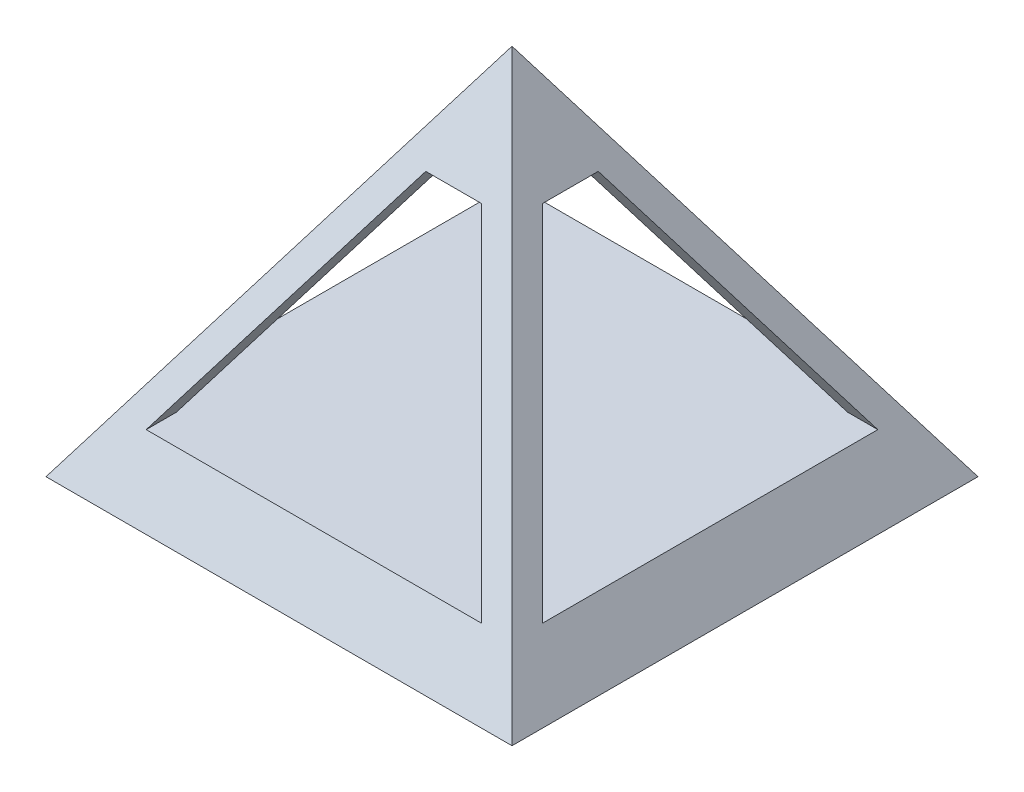
ISO-10303-21;
HEADER;
FILE_DESCRIPTION(('STEP AP214'),'2;1');
FILE_NAME('part.step','',(''),(''),'','','');
FILE_SCHEMA(('AUTOMOTIVE_DESIGN { 1 0 10303 214 1 1 1 1 }'));
ENDSEC;
DATA;
#1=APPLICATION_CONTEXT('core data for automotive mechanical design processes');
#2=APPLICATION_PROTOCOL_DEFINITION('international standard','automotive_design',2000,#1);
#3=PRODUCT_CONTEXT('',#1,'mechanical');
#4=PRODUCT('Part','Part','',(#3));
#5=PRODUCT_RELATED_PRODUCT_CATEGORY('part','',(#4));
#6=PRODUCT_DEFINITION_FORMATION('','',#4);
#7=PRODUCT_DEFINITION_CONTEXT('part definition',#1,'design');
#8=PRODUCT_DEFINITION('design','',#6,#7);
#9=PRODUCT_DEFINITION_SHAPE('','',#8);
#10=(LENGTH_UNIT() NAMED_UNIT(*) SI_UNIT(.MILLI.,.METRE.));
#11=(NAMED_UNIT(*) PLANE_ANGLE_UNIT() SI_UNIT($,.RADIAN.));
#12=(NAMED_UNIT(*) SI_UNIT($,.STERADIAN.) SOLID_ANGLE_UNIT());
#13=UNCERTAINTY_MEASURE_WITH_UNIT(LENGTH_MEASURE(1.E-05),#10,'distance_accuracy_value','');
#14=(GEOMETRIC_REPRESENTATION_CONTEXT(3) GLOBAL_UNCERTAINTY_ASSIGNED_CONTEXT((#13)) GLOBAL_UNIT_ASSIGNED_CONTEXT((#10,
#11,#12)) REPRESENTATION_CONTEXT('',''));
#15=CARTESIAN_POINT('',(0.,0.,0.));
#16=DIRECTION('',(0.,0.,1.));
#17=DIRECTION('',(1.,0.,0.));
#18=AXIS2_PLACEMENT_3D('',#15,#16,#17);
#19=CARTESIAN_POINT('',(18.,6.,40.));
#20=DIRECTION('',(-0.847998304005088,-0.52999894000318,0.));
#21=DIRECTION('',(0.52999894000318,-0.847998304005088,0.));
#22=AXIS2_PLACEMENT_3D('',#19,#20,#21);
#23=PLANE('',#22);
#24=DIRECTION('',(-0.468292905790847,0.749268649265355,-0.468292905790847));
#25=VECTOR('',#24,1.);
#26=CARTESIAN_POINT('',(22.8245614035088,-1.71929824561403,22.8245614035088));
#27=LINE('',#26,#25);
#28=CARTESIAN_POINT('',(18.,6.,18.));
#29=VERTEX_POINT('',#28);
#30=CARTESIAN_POINT('',(3.,30.,3.));
#31=VERTEX_POINT('',#30);
#32=EDGE_CURVE('E394',#29,#31,#27,.T.);
#33=ORIENTED_EDGE('',*,*,#32,.F.);
#34=DIRECTION('',(0.,0.,-1.));
#35=VECTOR('',#34,1.);
#36=CARTESIAN_POINT('',(18.,6.,40.));
#37=LINE('',#36,#35);
#38=CARTESIAN_POINT('',(18.,6.,21.25));
#39=VERTEX_POINT('',#38);
#40=EDGE_CURVE('E409',#39,#29,#37,.T.);
#41=ORIENTED_EDGE('',*,*,#40,.F.);
#42=DIRECTION('',(0.468292905790847,-0.749268649265355,0.468292905790847));
#43=VECTOR('',#42,1.);
#44=CARTESIAN_POINT('',(11.4978070175439,16.4035087719298,14.7478070175439));
#45=LINE('',#44,#43);
#46=CARTESIAN_POINT('',(3.,30.,6.25000000000001));
#47=VERTEX_POINT('',#46);
#48=EDGE_CURVE('E236',#47,#39,#45,.T.);
#49=ORIENTED_EDGE('',*,*,#48,.F.);
#50=DIRECTION('',(0.,0.,-1.));
#51=VECTOR('',#50,1.);
#52=CARTESIAN_POINT('',(3.,30.,40.));
#53=LINE('',#52,#51);
#54=EDGE_CURVE('E219',#47,#31,#53,.T.);
#55=ORIENTED_EDGE('',*,*,#54,.T.);
#56=EDGE_LOOP('',(#33,#41,#49,#55));
#57=FACE_BOUND('',#56,.T.);
#58=ADVANCED_FACE('F51',(#57),#23,.T.);
#59=CARTESIAN_POINT('',(-3.,30.,40.));
#60=DIRECTION('',(0.847998304005088,-0.52999894000318,0.));
#61=DIRECTION('',(0.52999894000318,0.847998304005088,0.));
#62=AXIS2_PLACEMENT_3D('',#59,#60,#61);
#63=PLANE('',#62);
#64=DIRECTION('',(-0.468292905790847,-0.749268649265355,0.468292905790847));
#65=VECTOR('',#64,1.);
#66=CARTESIAN_POINT('',(-11.1140350877193,17.0175438596491,11.1140350877193));
#67=LINE('',#66,#65);
#68=CARTESIAN_POINT('',(-3.,30.,3.));
#69=VERTEX_POINT('',#68);
#70=CARTESIAN_POINT('',(-18.,6.,18.));
#71=VERTEX_POINT('',#70);
#72=EDGE_CURVE('E448',#69,#71,#67,.T.);
#73=ORIENTED_EDGE('',*,*,#72,.F.);
#74=DIRECTION('',(0.,0.,-1.));
#75=VECTOR('',#74,1.);
#76=CARTESIAN_POINT('',(-3.,30.,40.));
#77=LINE('',#76,#75);
#78=CARTESIAN_POINT('',(-3.,30.,6.25));
#79=VERTEX_POINT('',#78);
#80=EDGE_CURVE('E220',#79,#69,#77,.T.);
#81=ORIENTED_EDGE('',*,*,#80,.F.);
#82=DIRECTION('',(0.468292905790847,0.749268649265355,-0.468292905790847));
#83=VECTOR('',#82,1.);
#84=CARTESIAN_POINT('',(-11.4978070175439,16.4035087719298,14.7478070175439));
#85=LINE('',#84,#83);
#86=CARTESIAN_POINT('',(-18.,5.99999999999999,21.25));
#87=VERTEX_POINT('',#86);
#88=EDGE_CURVE('E230',#87,#79,#85,.T.);
#89=ORIENTED_EDGE('',*,*,#88,.F.);
#90=DIRECTION('',(0.,0.,-1.));
#91=VECTOR('',#90,1.);
#92=CARTESIAN_POINT('',(-18.,5.99999999999999,40.));
#93=LINE('',#92,#91);
#94=EDGE_CURVE('E412',#87,#71,#93,.T.);
#95=ORIENTED_EDGE('',*,*,#94,.T.);
#96=EDGE_LOOP('',(#73,#81,#89,#95));
#97=FACE_BOUND('',#96,.T.);
#98=ADVANCED_FACE('F181',(#97),#63,.T.);
#99=CARTESIAN_POINT('',(0.,11.2359550561798,17.9775280898876));
#100=DIRECTION('',(0.,0.52999894000318,0.847998304005088));
#101=DIRECTION('',(0.,-0.847998304005088,0.52999894000318));
#102=AXIS2_PLACEMENT_3D('',#99,#100,#101);
#103=PLANE('',#102);
#104=DIRECTION('',(-0.468292905790847,-0.749268649265355,0.468292905790847));
#105=VECTOR('',#104,1.);
#106=CARTESIAN_POINT('',(0.,40.,0.));
#107=LINE('',#106,#105);
#108=CARTESIAN_POINT('',(0.,40.,0.));
#109=VERTEX_POINT('',#108);
#110=CARTESIAN_POINT('',(-25.,0.,25.));
#111=VERTEX_POINT('',#110);
#112=EDGE_CURVE('E305',#109,#111,#107,.T.);
#113=ORIENTED_EDGE('',*,*,#112,.T.);
#114=DIRECTION('',(1.,0.,0.));
#115=VECTOR('',#114,1.);
#116=CARTESIAN_POINT('',(-25.,0.,25.));
#117=LINE('',#116,#115);
#118=CARTESIAN_POINT('',(25.,0.,25.));
#119=VERTEX_POINT('',#118);
#120=EDGE_CURVE('E335',#111,#119,#117,.T.);
#121=ORIENTED_EDGE('',*,*,#120,.T.);
#122=DIRECTION('',(0.468292905790847,-0.749268649265355,0.468292905790847));
#123=VECTOR('',#122,1.);
#124=CARTESIAN_POINT('',(0.,40.,0.));
#125=LINE('',#124,#123);
#126=EDGE_CURVE('E261',#109,#119,#125,.T.);
#127=ORIENTED_EDGE('',*,*,#126,.F.);
#128=EDGE_LOOP('',(#113,#121,#127));
#129=FACE_BOUND('',#128,.T.);
#130=DIRECTION('',(1.,0.,0.));
#131=VECTOR('',#130,1.);
#132=CARTESIAN_POINT('',(0.,30.,6.25));
#133=LINE('',#132,#131);
#134=EDGE_CURVE('E233',#79,#47,#133,.T.);
#135=ORIENTED_EDGE('',*,*,#134,.T.);
#136=ORIENTED_EDGE('',*,*,#48,.T.);
#137=DIRECTION('',(-1.,0.,0.));
#138=VECTOR('',#137,1.);
#139=CARTESIAN_POINT('',(0.,6.,21.25));
#140=LINE('',#139,#138);
#141=EDGE_CURVE('E223',#39,#87,#140,.T.);
#142=ORIENTED_EDGE('',*,*,#141,.T.);
#143=ORIENTED_EDGE('',*,*,#88,.T.);
#144=EDGE_LOOP('',(#135,#136,#142,#143));
#145=FACE_BOUND('',#144,.T.);
#146=ADVANCED_FACE('F188',(#129,#145),#103,.T.);
#147=CARTESIAN_POINT('',(0.,11.2359550561798,-17.9775280898876));
#148=DIRECTION('',(0.,0.52999894000318,-0.847998304005088));
#149=DIRECTION('',(0.,0.847998304005088,0.52999894000318));
#150=AXIS2_PLACEMENT_3D('',#147,#148,#149);
#151=PLANE('',#150);
#152=DIRECTION('',(0.468292905790847,-0.749268649265355,-0.468292905790847));
#153=VECTOR('',#152,1.);
#154=CARTESIAN_POINT('',(0.,40.,0.));
#155=LINE('',#154,#153);
#156=CARTESIAN_POINT('',(25.,0.,-25.));
#157=VERTEX_POINT('',#156);
#158=EDGE_CURVE('E249',#109,#157,#155,.T.);
#159=ORIENTED_EDGE('',*,*,#158,.T.);
#160=DIRECTION('',(-1.,0.,0.));
#161=VECTOR('',#160,1.);
#162=CARTESIAN_POINT('',(-25.,0.,-25.));
#163=LINE('',#162,#161);
#164=CARTESIAN_POINT('',(-25.,0.,-25.));
#165=VERTEX_POINT('',#164);
#166=EDGE_CURVE('E244',#157,#165,#163,.T.);
#167=ORIENTED_EDGE('',*,*,#166,.T.);
#168=DIRECTION('',(-0.468292905790847,-0.749268649265355,-0.468292905790847));
#169=VECTOR('',#168,1.);
#170=CARTESIAN_POINT('',(0.,40.,0.));
#171=LINE('',#170,#169);
#172=EDGE_CURVE('E257',#109,#165,#171,.T.);
#173=ORIENTED_EDGE('',*,*,#172,.F.);
#174=EDGE_LOOP('',(#159,#167,#173));
#175=FACE_BOUND('',#174,.T.);
#176=DIRECTION('',(1.,0.,0.));
#177=VECTOR('',#176,1.);
#178=CARTESIAN_POINT('',(0.,6.,-21.25));
#179=LINE('',#178,#177);
#180=CARTESIAN_POINT('',(-18.,5.99999999999999,-21.25));
#181=VERTEX_POINT('',#180);
#182=CARTESIAN_POINT('',(18.,6.,-21.25));
#183=VERTEX_POINT('',#182);
#184=EDGE_CURVE('E256',#181,#183,#179,.T.);
#185=ORIENTED_EDGE('',*,*,#184,.T.);
#186=DIRECTION('',(-0.468292905790847,0.749268649265355,0.468292905790847));
#187=VECTOR('',#186,1.);
#188=CARTESIAN_POINT('',(11.4978070175439,16.4035087719298,-14.7478070175439));
#189=LINE('',#188,#187);
#190=CARTESIAN_POINT('',(3.,30.,-6.25000000000001));
#191=VERTEX_POINT('',#190);
#192=EDGE_CURVE('E12',#183,#191,#189,.T.);
#193=ORIENTED_EDGE('',*,*,#192,.T.);
#194=DIRECTION('',(-1.,0.,0.));
#195=VECTOR('',#194,1.);
#196=CARTESIAN_POINT('',(0.,30.,-6.25000000000001));
#197=LINE('',#196,#195);
#198=CARTESIAN_POINT('',(-3.,30.,-6.25));
#199=VERTEX_POINT('',#198);
#200=EDGE_CURVE('E66',#191,#199,#197,.T.);
#201=ORIENTED_EDGE('',*,*,#200,.T.);
#202=DIRECTION('',(-0.468292905790847,-0.749268649265355,-0.468292905790847));
#203=VECTOR('',#202,1.);
#204=CARTESIAN_POINT('',(-11.4978070175439,16.4035087719298,-14.7478070175439));
#205=LINE('',#204,#203);
#206=EDGE_CURVE('E353',#199,#181,#205,.T.);
#207=ORIENTED_EDGE('',*,*,#206,.T.);
#208=EDGE_LOOP('',(#185,#193,#201,#207));
#209=FACE_BOUND('',#208,.T.);
#210=ADVANCED_FACE('F53',(#175,#209),#151,.T.);
#211=CARTESIAN_POINT('',(0.,0.,0.));
#212=DIRECTION('',(0.,1.,0.));
#213=DIRECTION('',(0.,0.,1.));
#214=AXIS2_PLACEMENT_3D('',#211,#212,#213);
#215=PLANE('',#214);
#216=DIRECTION('',(0.,0.,-1.));
#217=VECTOR('',#216,1.);
#218=CARTESIAN_POINT('',(25.,0.,-25.));
#219=LINE('',#218,#217);
#220=EDGE_CURVE('E239',#119,#157,#219,.T.);
#221=ORIENTED_EDGE('',*,*,#220,.F.);
#222=ORIENTED_EDGE('',*,*,#120,.F.);
#223=DIRECTION('',(0.,0.,1.));
#224=VECTOR('',#223,1.);
#225=CARTESIAN_POINT('',(-25.,0.,-25.));
#226=LINE('',#225,#224);
#227=EDGE_CURVE('E306',#165,#111,#226,.T.);
#228=ORIENTED_EDGE('',*,*,#227,.F.);
#229=ORIENTED_EDGE('',*,*,#166,.F.);
#230=EDGE_LOOP('',(#221,#222,#228,#229));
#231=FACE_BOUND('',#230,.T.);
#232=ADVANCED_FACE('F283',(#231),#215,.F.);
#233=CARTESIAN_POINT('',(17.9775280898876,11.2359550561798,0.));
#234=DIRECTION('',(0.847998304005088,0.52999894000318,0.));
#235=DIRECTION('',(-0.52999894000318,0.847998304005088,0.));
#236=AXIS2_PLACEMENT_3D('',#233,#234,#235);
#237=PLANE('',#236);
#238=DIRECTION('',(0.468292905790847,-0.749268649265355,0.468292905790847));
#239=VECTOR('',#238,1.);
#240=CARTESIAN_POINT('',(14.7478070175439,16.4035087719298,11.4978070175439));
#241=LINE('',#240,#239);
#242=CARTESIAN_POINT('',(6.25000000000001,30.,3.));
#243=VERTEX_POINT('',#242);
#244=CARTESIAN_POINT('',(21.25,6.,18.));
#245=VERTEX_POINT('',#244);
#246=EDGE_CURVE('E393',#243,#245,#241,.T.);
#247=ORIENTED_EDGE('',*,*,#246,.F.);
#248=DIRECTION('',(0.,0.,1.));
#249=VECTOR('',#248,1.);
#250=CARTESIAN_POINT('',(6.25,30.,0.));
#251=LINE('',#250,#249);
#252=CARTESIAN_POINT('',(6.25,30.,-3.));
#253=VERTEX_POINT('',#252);
#254=EDGE_CURVE('E400',#253,#243,#251,.T.);
#255=ORIENTED_EDGE('',*,*,#254,.F.);
#256=DIRECTION('',(-0.468292905790847,0.749268649265355,0.468292905790847));
#257=VECTOR('',#256,1.);
#258=CARTESIAN_POINT('',(14.7478070175439,16.4035087719298,-11.4978070175439));
#259=LINE('',#258,#257);
#260=CARTESIAN_POINT('',(21.25,6.,-18.));
#261=VERTEX_POINT('',#260);
#262=EDGE_CURVE('E449',#261,#253,#259,.T.);
#263=ORIENTED_EDGE('',*,*,#262,.F.);
#264=DIRECTION('',(0.,0.,-1.));
#265=VECTOR('',#264,1.);
#266=CARTESIAN_POINT('',(21.25,6.,0.));
#267=LINE('',#266,#265);
#268=EDGE_CURVE('E407',#245,#261,#267,.T.);
#269=ORIENTED_EDGE('',*,*,#268,.F.);
#270=EDGE_LOOP('',(#247,#255,#263,#269));
#271=FACE_BOUND('',#270,.T.);
#272=ORIENTED_EDGE('',*,*,#126,.T.);
#273=ORIENTED_EDGE('',*,*,#220,.T.);
#274=ORIENTED_EDGE('',*,*,#158,.F.);
#275=EDGE_LOOP('',(#272,#273,#274));
#276=FACE_BOUND('',#275,.T.);
#277=ADVANCED_FACE('F203',(#271,#276),#237,.T.);
#278=CARTESIAN_POINT('',(-17.9775280898876,11.2359550561798,0.));
#279=DIRECTION('',(-0.847998304005088,0.52999894000318,0.));
#280=DIRECTION('',(-0.52999894000318,-0.847998304005088,0.));
#281=AXIS2_PLACEMENT_3D('',#278,#279,#280);
#282=PLANE('',#281);
#283=DIRECTION('',(0.468292905790847,0.749268649265355,-0.468292905790847));
#284=VECTOR('',#283,1.);
#285=CARTESIAN_POINT('',(-14.7478070175439,16.4035087719298,11.4978070175439));
#286=LINE('',#285,#284);
#287=CARTESIAN_POINT('',(-21.25,6.,18.));
#288=VERTEX_POINT('',#287);
#289=CARTESIAN_POINT('',(-6.25000000000001,30.,3.));
#290=VERTEX_POINT('',#289);
#291=EDGE_CURVE('E387',#288,#290,#286,.T.);
#292=ORIENTED_EDGE('',*,*,#291,.F.);
#293=DIRECTION('',(0.,0.,1.));
#294=VECTOR('',#293,1.);
#295=CARTESIAN_POINT('',(-21.25,6.,0.));
#296=LINE('',#295,#294);
#297=CARTESIAN_POINT('',(-21.25,6.,-18.));
#298=VERTEX_POINT('',#297);
#299=EDGE_CURVE('E402',#298,#288,#296,.T.);
#300=ORIENTED_EDGE('',*,*,#299,.F.);
#301=DIRECTION('',(-0.468292905790847,-0.749268649265355,-0.468292905790847));
#302=VECTOR('',#301,1.);
#303=CARTESIAN_POINT('',(-14.7478070175439,16.4035087719298,-11.4978070175439));
#304=LINE('',#303,#302);
#305=CARTESIAN_POINT('',(-6.25000000000001,30.,-3.));
#306=VERTEX_POINT('',#305);
#307=EDGE_CURVE('E215',#306,#298,#304,.T.);
#308=ORIENTED_EDGE('',*,*,#307,.F.);
#309=DIRECTION('',(0.,0.,-1.));
#310=VECTOR('',#309,1.);
#311=CARTESIAN_POINT('',(-6.25000000000001,30.,0.));
#312=LINE('',#311,#310);
#313=EDGE_CURVE('E397',#290,#306,#312,.T.);
#314=ORIENTED_EDGE('',*,*,#313,.F.);
#315=EDGE_LOOP('',(#292,#300,#308,#314));
#316=FACE_BOUND('',#315,.T.);
#317=ORIENTED_EDGE('',*,*,#172,.T.);
#318=ORIENTED_EDGE('',*,*,#227,.T.);
#319=ORIENTED_EDGE('',*,*,#112,.F.);
#320=EDGE_LOOP('',(#317,#318,#319));
#321=FACE_BOUND('',#320,.T.);
#322=ADVANCED_FACE('F196',(#316,#321),#282,.T.);
#323=DIRECTION('',(0.468292905790847,-0.749268649265355,-0.468292905790847));
#324=VECTOR('',#323,1.);
#325=CARTESIAN_POINT('',(5.28070175438596,26.3508771929825,-5.28070175438596));
#326=LINE('',#325,#324);
#327=CARTESIAN_POINT('',(3.,30.,-3.));
#328=VERTEX_POINT('',#327);
#329=CARTESIAN_POINT('',(18.,6.,-18.));
#330=VERTEX_POINT('',#329);
#331=EDGE_CURVE('E207',#328,#330,#326,.T.);
#332=ORIENTED_EDGE('',*,*,#331,.F.);
#333=EDGE_CURVE('E209',#328,#191,#53,.T.);
#334=ORIENTED_EDGE('',*,*,#333,.T.);
#335=ORIENTED_EDGE('',*,*,#192,.F.);
#336=EDGE_CURVE('E211',#330,#183,#37,.T.);
#337=ORIENTED_EDGE('',*,*,#336,.F.);
#338=EDGE_LOOP('',(#332,#334,#335,#337));
#339=FACE_BOUND('',#338,.T.);
#340=ADVANCED_FACE('F184',(#339),#23,.T.);
#341=CARTESIAN_POINT('',(0.,30.,40.));
#342=DIRECTION('',(0.,-1.,0.));
#343=DIRECTION('',(0.,0.,-1.));
#344=AXIS2_PLACEMENT_3D('',#341,#342,#343);
#345=PLANE('',#344);
#346=CARTESIAN_POINT('',(0.698735616042956,30.,0.362506307032836));
#347=CARTESIAN_POINT('',(0.688727502452102,30.,0.381239528464891));
#348=CARTESIAN_POINT('',(0.677947188972977,30.,0.399552580812434));
#349=CARTESIAN_POINT('',(0.643304165538712,30.,0.453176029753697));
#350=CARTESIAN_POINT('',(0.617183619228201,30.,0.487068457259993));
#351=CARTESIAN_POINT('',(0.559710448457188,30.,0.550047055656198));
#352=CARTESIAN_POINT('',(0.528357683704992,30.,0.579133097630659));
#353=CARTESIAN_POINT('',(0.460805574597999,30.,0.632079839722632));
#354=CARTESIAN_POINT('',(0.42454582966589,30.,0.655863664042715));
#355=CARTESIAN_POINT('',(0.348495292269187,30.,0.697039402609063));
#356=CARTESIAN_POINT('',(0.30869943428275,30.,0.71442195757894));
#357=CARTESIAN_POINT('',(0.226808029383583,30.,0.742247650638629));
#358=CARTESIAN_POINT('',(0.18471521538144,30.,0.752698848868026));
#359=CARTESIAN_POINT('',(0.0993477907428596,30.,0.766375115165574));
#360=CARTESIAN_POINT('',(0.0560731331093774,30.,0.769599895444148));
#361=CARTESIAN_POINT('',(-0.00875981782881057,30.,0.768975580640075));
#362=CARTESIAN_POINT('',(-0.0303766694675205,30.,0.767853820022163));
#363=CARTESIAN_POINT('',(-0.0734193690297621,30.,0.763803606562379));
#364=CARTESIAN_POINT('',(-0.0948453867786788,30.,0.760876966905022));
#365=CARTESIAN_POINT('',(-0.158649026975268,30.,0.74937359136814));
#366=CARTESIAN_POINT('',(-0.200566124021889,30.,0.738073271178249));
#367=CARTESIAN_POINT('',(-0.281950645028544,30.,0.708656396587507));
#368=CARTESIAN_POINT('',(-0.321415827655794,30.,0.690533709532271));
#369=CARTESIAN_POINT('',(-0.396719433360025,30.,0.647836092533776));
#370=CARTESIAN_POINT('',(-0.432557871964673,30.,0.62326119021687));
#371=CARTESIAN_POINT('',(-0.482852724348713,30.,0.58223791589653));
#372=CARTESIAN_POINT('',(-0.499045880678959,30.,0.567863926538758));
#373=CARTESIAN_POINT('',(-0.530149417795068,30.,0.5377891202565));
#374=CARTESIAN_POINT('',(-0.545059882928042,30.,0.522088390710491));
#375=CARTESIAN_POINT('',(-0.587719071046647,30.,0.473190998615705));
#376=CARTESIAN_POINT('',(-0.613425074489061,30.,0.438174998413257));
#377=CARTESIAN_POINT('',(-0.658570842236536,30.,0.364347388579398));
#378=CARTESIAN_POINT('',(-0.678015308861914,30.,0.325538655918534));
#379=CARTESIAN_POINT('',(-0.702069234803913,30.,0.265337164562847));
#380=CARTESIAN_POINT('',(-0.709235888976471,30.,0.24493485115426));
#381=CARTESIAN_POINT('',(-0.721840504378618,30.,0.203581941313325));
#382=CARTESIAN_POINT('',(-0.727276789299079,30.,0.182630834364517));
#383=CARTESIAN_POINT('',(-0.740892969803049,30.,0.11921485186475));
#384=CARTESIAN_POINT('',(-0.746397831935323,30.,0.0761431038699264));
#385=CARTESIAN_POINT('',(-0.750100268325442,30.,-0.0102904206502881));
#386=CARTESIAN_POINT('',(-0.748297825417736,30.,-0.0536521978567464));
#387=CARTESIAN_POINT('',(-0.73743770585457,30.,-0.139489687235226));
#388=CARTESIAN_POINT('',(-0.728375786842405,30.,-0.181964866392555));
#389=CARTESIAN_POINT('',(-0.703260772976074,30.,-0.264730064520099));
#390=CARTESIAN_POINT('',(-0.687217289795126,30.,-0.305023002378025));
#391=CARTESIAN_POINT('',(-0.648875869051407,30.,-0.381794938587382));
#392=CARTESIAN_POINT('',(-0.626670506946585,30.,-0.418320179670301));
#393=CARTESIAN_POINT('',(-0.576540855742741,30.,-0.487179977404838));
#394=CARTESIAN_POINT('',(-0.548618726286347,30.,-0.519516109080634));
#395=CARTESIAN_POINT('',(-0.487375378186653,30.,-0.579553102303866));
#396=CARTESIAN_POINT('',(-0.45398519522094,30.,-0.607184108330412));
#397=CARTESIAN_POINT('',(-0.400798053850978,30.,-0.644118832221191));
#398=CARTESIAN_POINT('',(-0.382534485976219,30.,-0.655686677678836));
#399=CARTESIAN_POINT('',(-0.345087515766755,30.,-0.677268193775462));
#400=CARTESIAN_POINT('',(-0.325903247741642,30.,-0.687280362670317));
#401=CARTESIAN_POINT('',(-0.267174296736949,30.,-0.714825481909515));
#402=CARTESIAN_POINT('',(-0.226433145875465,30.,-0.729881158452682));
#403=CARTESIAN_POINT('',(-0.143023530168124,30.,-0.752941529587144));
#404=CARTESIAN_POINT('',(-0.100355074378954,30.,-0.760946257308257));
#405=CARTESIAN_POINT('',(-0.0143013879770448,30.,-0.76966614321723));
#406=CARTESIAN_POINT('',(0.0290834871482542,30.,-0.770384813973665));
#407=CARTESIAN_POINT('',(0.115385630320174,30.,-0.764541225406988));
#408=CARTESIAN_POINT('',(0.158302876813065,30.,-0.757978631900619));
#409=CARTESIAN_POINT('',(0.221314047489314,30.,-0.742789927922352));
#410=CARTESIAN_POINT('',(0.242086151674364,30.,-0.736838013734894));
#411=CARTESIAN_POINT('',(0.283067626541194,30.,-0.723228354339628));
#412=CARTESIAN_POINT('',(0.30327702412844,30.,-0.71557069084928));
#413=CARTESIAN_POINT('',(0.342984399325103,30.,-0.698586145900696));
#414=CARTESIAN_POINT('',(0.362482344789623,30.,-0.689259189132448));
#415=CARTESIAN_POINT('',(0.400606308313451,30.,-0.668978444138752));
#416=CARTESIAN_POINT('',(0.419232315419086,30.,-0.658024635483284));
#417=CARTESIAN_POINT('',(0.473692735959604,30.,-0.622848410578923));
#418=CARTESIAN_POINT('',(0.508080010622343,30.,-0.596323932921439));
#419=CARTESIAN_POINT('',(0.571880995953807,30.,-0.537876223987606));
#420=CARTESIAN_POINT('',(0.601294655608471,30.,-0.505952937342725));
#421=CARTESIAN_POINT('',(0.654384996826454,30.,-0.437588594935188));
#422=CARTESIAN_POINT('',(0.678055701131193,30.,-0.401142891353293));
#423=CARTESIAN_POINT('',(0.718924087105046,30.,-0.324789199295336));
#424=CARTESIAN_POINT('',(0.736122176637524,30.,-0.284881429171941));
#425=CARTESIAN_POINT('',(0.763559969394291,30.,-0.202789448887683));
#426=CARTESIAN_POINT('',(0.77380616379231,30.,-0.160607402126522));
#427=CARTESIAN_POINT('',(0.787066004163391,30.,-0.0750986879614212));
#428=CARTESIAN_POINT('',(0.790079742902614,30.,-0.0317720352458302));
#429=CARTESIAN_POINT('',(0.78910748177111,30.,0.0331257919561837));
#430=CARTESIAN_POINT('',(0.787862952863401,30.,0.0547698120703801));
#431=CARTESIAN_POINT('',(0.783566386988593,30.,0.0978568543711607));
#432=CARTESIAN_POINT('',(0.78051604308543,30.,0.119300045742517));
#433=CARTESIAN_POINT('',(0.768664385996557,30.,0.183074103438013));
#434=CARTESIAN_POINT('',(0.757161092080812,30.,0.224937459533275));
#435=CARTESIAN_POINT('',(0.729987650956424,30.,0.298813408267058));
#436=CARTESIAN_POINT('',(0.715436840014932,30.,0.331244898575273));
#437=CARTESIAN_POINT('',(0.698735616042956,30.,0.362506307032836));
#438=B_SPLINE_CURVE_WITH_KNOTS('',3,(#346,#347,#348,#349,#350,#351,#352,#353,#354,#355,#356,
#357,#358,#359,#360,#361,#362,#363,#364,#365,#366,#367,#368,#369,#370,#371,#372,#373,#374,#375,
#376,#377,#378,#379,#380,#381,#382,#383,#384,#385,#386,#387,#388,#389,#390,#391,#392,#393,#394,
#395,#396,#397,#398,#399,#400,#401,#402,#403,#404,#405,#406,#407,#408,#409,#410,#411,#412,#413,
#414,#415,#416,#417,#418,#419,#420,#421,#422,#423,#424,#425,#426,#427,#428,#429,#430,#431,#432,
#433,#434,#435,#436,#437),.UNSPECIFIED.,.T.,.F.,(4,2,2,2,2,2,2,2,2,2,2,2,2,2,2,2,2,2,2,2,2,2,2,
2,2,2,2,2,2,2,2,2,2,2,2,2,2,2,2,2,2,2,2,2,2,4),(0.,0.0636964569353126,0.191419616143731,
0.319146200549032,0.448619021582364,0.578280399832031,0.707790735526201,0.837306228832696,
0.902178568856346,0.966985843941558,1.0965592725577,1.22624945447815,1.35593908111516,
1.42083184205063,1.48572033250579,1.61538447248135,1.74495100830304,1.80975700097243,
1.87462558522747,2.00422177631571,2.13381827183783,2.2634905573994,2.3929848822774,
2.52063021555253,2.64822741649735,2.77757924078528,2.84236994894177,2.90722281817505,
3.0368552863571,3.16648714544057,3.29605650673388,3.42563181503047,3.49039259394614,
3.55515027102932,3.61991087038598,3.68467228307558,3.81429041613725,3.94390987860341,
4.07366367556273,4.20340929488654,4.3330335998546,4.4626562422043,4.52762882723609,
4.59254059268456,4.72210342240574,4.82839805863671),.UNSPECIFIED.);
#439=CARTESIAN_POINT('',(0.698735616042956,30.,0.362506307032836));
#440=VERTEX_POINT('',#439);
#441=EDGE_CURVE('E56',#440,#440,#438,.T.);
#442=ORIENTED_EDGE('',*,*,#441,.F.);
#443=EDGE_LOOP('',(#442));
#444=FACE_BOUND('',#443,.T.);
#445=ORIENTED_EDGE('',*,*,#333,.F.);
#446=DIRECTION('',(-1.,0.,0.));
#447=VECTOR('',#446,1.);
#448=CARTESIAN_POINT('',(40.,30.,-3.));
#449=LINE('',#448,#447);
#450=EDGE_CURVE('E74',#253,#328,#449,.T.);
#451=ORIENTED_EDGE('',*,*,#450,.F.);
#452=ORIENTED_EDGE('',*,*,#254,.T.);
#453=DIRECTION('',(-1.,0.,0.));
#454=VECTOR('',#453,1.);
#455=CARTESIAN_POINT('',(40.,30.,3.));
#456=LINE('',#455,#454);
#457=EDGE_CURVE('E459',#243,#31,#456,.T.);
#458=ORIENTED_EDGE('',*,*,#457,.T.);
#459=ORIENTED_EDGE('',*,*,#54,.F.);
#460=ORIENTED_EDGE('',*,*,#134,.F.);
#461=ORIENTED_EDGE('',*,*,#80,.T.);
#462=EDGE_CURVE('E81',#69,#290,#456,.T.);
#463=ORIENTED_EDGE('',*,*,#462,.T.);
#464=ORIENTED_EDGE('',*,*,#313,.T.);
#465=CARTESIAN_POINT('',(-3.,30.,-3.));
#466=VERTEX_POINT('',#465);
#467=EDGE_CURVE('E460',#466,#306,#449,.T.);
#468=ORIENTED_EDGE('',*,*,#467,.F.);
#469=EDGE_CURVE('E224',#466,#199,#77,.T.);
#470=ORIENTED_EDGE('',*,*,#469,.T.);
#471=ORIENTED_EDGE('',*,*,#200,.F.);
#472=EDGE_LOOP('',(#445,#451,#452,#458,#459,#460,#461,#463,#464,#468,#470,#471));
#473=FACE_BOUND('',#472,.T.);
#474=ADVANCED_FACE('F195',(#444,#473),#345,.T.);
#475=DIRECTION('',(0.468292905790847,0.749268649265355,0.468292905790847));
#476=VECTOR('',#475,1.);
#477=CARTESIAN_POINT('',(6.42982456140351,45.0877192982456,6.42982456140351));
#478=LINE('',#477,#476);
#479=CARTESIAN_POINT('',(-18.,6.,-18.));
#480=VERTEX_POINT('',#479);
#481=EDGE_CURVE('E216',#480,#466,#478,.T.);
#482=ORIENTED_EDGE('',*,*,#481,.F.);
#483=EDGE_CURVE('E411',#480,#181,#93,.T.);
#484=ORIENTED_EDGE('',*,*,#483,.T.);
#485=ORIENTED_EDGE('',*,*,#206,.F.);
#486=ORIENTED_EDGE('',*,*,#469,.F.);
#487=EDGE_LOOP('',(#482,#484,#485,#486));
#488=FACE_BOUND('',#487,.T.);
#489=ADVANCED_FACE('F191',(#488),#63,.T.);
#490=CARTESIAN_POINT('',(-18.,5.99999999999999,40.));
#491=DIRECTION('',(0.,1.,0.));
#492=DIRECTION('',(-1.,0.,0.));
#493=AXIS2_PLACEMENT_3D('',#490,#491,#492);
#494=PLANE('',#493);
#495=CARTESIAN_POINT('',(0.601985965730706,6.,-0.0454154534352885));
#496=CARTESIAN_POINT('',(0.599531916975282,6.,-0.07718177586002));
#497=CARTESIAN_POINT('',(0.594489101419636,6.,-0.108719237825701));
#498=CARTESIAN_POINT('',(0.579361779543637,6.,-0.17061050963488));
#499=CARTESIAN_POINT('',(0.569271986502619,6.,-0.200963042244985));
#500=CARTESIAN_POINT('',(0.543859799861399,6.,-0.260692498121535));
#501=CARTESIAN_POINT('',(0.52836173917339,6.,-0.28999470287985));
#502=CARTESIAN_POINT('',(0.492643345259068,6.,-0.345634206775551));
#503=CARTESIAN_POINT('',(0.472415068051763,6.,-0.371966406542997));
#504=CARTESIAN_POINT('',(0.427801878102108,6.,-0.420876556992881));
#505=CARTESIAN_POINT('',(0.403413540534008,6.,-0.443451383867708));
#506=CARTESIAN_POINT('',(0.351235187947228,6.,-0.48414920489218));
#507=CARTESIAN_POINT('',(0.323450911820126,6.,-0.50227955817095));
#508=CARTESIAN_POINT('',(0.265218980378748,6.,-0.533626302000944));
#509=CARTESIAN_POINT('',(0.23477010022889,6.,-0.546840417899222));
#510=CARTESIAN_POINT('',(0.172086210748924,6.,-0.567965410284656));
#511=CARTESIAN_POINT('',(0.139851206809247,6.,-0.575876302775725));
#512=CARTESIAN_POINT('',(0.0745555448802234,6.,-0.586178794771179));
#513=CARTESIAN_POINT('',(0.0414960810650682,6.,-0.588577956053051));
#514=CARTESIAN_POINT('',(-0.0245549642176583,6.,-0.587784202492602));
#515=CARTESIAN_POINT('',(-0.0575465455459368,6.,-0.584591276186919));
#516=CARTESIAN_POINT('',(-0.122589562724016,6.,-0.572730642156718));
#517=CARTESIAN_POINT('',(-0.154639285051894,6.,-0.564053533117191));
#518=CARTESIAN_POINT('',(-0.216818418597469,6.,-0.541422072450512));
#519=CARTESIAN_POINT('',(-0.246947826185019,6.,-0.527467710847636));
#520=CARTESIAN_POINT('',(-0.304465241731711,6.,-0.494696560084819));
#521=CARTESIAN_POINT('',(-0.331851095307445,6.,-0.475875990608219));
#522=CARTESIAN_POINT('',(-0.383063718789349,6.,-0.433892137050535));
#523=CARTESIAN_POINT('',(-0.406890470043173,6.,-0.41072883021171));
#524=CARTESIAN_POINT('',(-0.450292869404695,6.,-0.360758806437305));
#525=CARTESIAN_POINT('',(-0.469873150177699,6.,-0.333956112330981));
#526=CARTESIAN_POINT('',(-0.504252684803878,6.,-0.277442169845427));
#527=CARTESIAN_POINT('',(-0.519051990995336,6.,-0.247730953311012));
#528=CARTESIAN_POINT('',(-0.543453320065533,6.,-0.186244491375626));
#529=CARTESIAN_POINT('',(-0.553055118539436,6.,-0.154469156921722));
#530=CARTESIAN_POINT('',(-0.56678473474209,6.,-0.0897570438130802));
#531=CARTESIAN_POINT('',(-0.570912506817115,6.,-0.056820255474096));
#532=CARTESIAN_POINT('',(-0.573584821684454,6.,0.00926742523043489));
#533=CARTESIAN_POINT('',(-0.572131338559865,6.,0.0424182377549015));
#534=CARTESIAN_POINT('',(-0.563676545011874,6.,0.108004589783801));
#535=CARTESIAN_POINT('',(-0.556675276927224,6.,0.140440134744964));
#536=CARTESIAN_POINT('',(-0.537327143551159,6.,0.203689755186423));
#537=CARTESIAN_POINT('',(-0.524978119903425,6.,0.234503170336765));
#538=CARTESIAN_POINT('',(-0.495280654786967,6.,0.293619100276205));
#539=CARTESIAN_POINT('',(-0.477932167574044,6.,0.321921592087702));
#540=CARTESIAN_POINT('',(-0.438720807140877,6.,0.375224770439731));
#541=CARTESIAN_POINT('',(-0.41685578671015,6.,0.400223877210926));
#542=CARTESIAN_POINT('',(-0.369237969086975,6.,0.446196113180249));
#543=CARTESIAN_POINT('',(-0.34348520233292,6.,0.467169273895858));
#544=CARTESIAN_POINT('',(-0.288860183102867,6.,0.504453980672159));
#545=CARTESIAN_POINT('',(-0.259992694246789,6.,0.52077251000762));
#546=CARTESIAN_POINT('',(-0.199891462154622,6.,0.548373289258526));
#547=CARTESIAN_POINT('',(-0.168654449029015,6.,0.559648425901266));
#548=CARTESIAN_POINT('',(-0.10472368055096,6.,0.576759546843269));
#549=CARTESIAN_POINT('',(-0.0720297886963178,6.,0.582595020346004));
#550=CARTESIAN_POINT('',(-0.00613546706638835,6.,0.588740124462276));
#551=CARTESIAN_POINT('',(0.0270648042004903,6.,0.589051450119625));
#552=CARTESIAN_POINT('',(0.0930179359367731,6.,0.584042566715808));
#553=CARTESIAN_POINT('',(0.12577104943279,6.,0.578725688584424));
#554=CARTESIAN_POINT('',(0.189936664519815,6.,0.562718159566455));
#555=CARTESIAN_POINT('',(0.221349110109847,6.,0.552027284440775));
#556=CARTESIAN_POINT('',(0.281942045964579,6.,0.525484352214298));
#557=CARTESIAN_POINT('',(0.311120886690149,6.,0.509628525304681));
#558=CARTESIAN_POINT('',(0.366363871140359,6.,0.473288253843418));
#559=CARTESIAN_POINT('',(0.392433215524167,6.,0.452811708239253));
#560=CARTESIAN_POINT('',(0.440820180011031,6.,0.407714941051062));
#561=CARTESIAN_POINT('',(0.463128718725056,6.,0.383084968684543));
#562=CARTESIAN_POINT('',(0.503263407279538,6.,0.330465717081562));
#563=CARTESIAN_POINT('',(0.521095651813714,6.,0.302481082984432));
#564=CARTESIAN_POINT('',(0.551816951754166,6.,0.243897473547157));
#565=CARTESIAN_POINT('',(0.564703695300952,6.,0.213297283673108));
#566=CARTESIAN_POINT('',(0.585147262647903,6.,0.150417130909808));
#567=CARTESIAN_POINT('',(0.592709785753089,6.,0.118139004047412));
#568=CARTESIAN_POINT('',(0.603847050651058,6.,0.0421754647450456));
#569=CARTESIAN_POINT('',(0.605352665359406,6.,-0.00183536331843366));
#570=CARTESIAN_POINT('',(0.601985965730706,6.,-0.0454154534352885));
#571=B_SPLINE_CURVE_WITH_KNOTS('',3,(#495,#496,#497,#498,#499,#500,#501,#502,#503,#504,#505,
#506,#507,#508,#509,#510,#511,#512,#513,#514,#515,#516,#517,#518,#519,#520,#521,#522,#523,#524,
#525,#526,#527,#528,#529,#530,#531,#532,#533,#534,#535,#536,#537,#538,#539,#540,#541,#542,#543,
#544,#545,#546,#547,#548,#549,#550,#551,#552,#553,#554,#555,#556,#557,#558,#559,#560,#561,#562,
#563,#564,#565,#566,#567,#568,#569,#570),.UNSPECIFIED.,.T.,.F.,(4,2,2,2,2,2,2,2,2,2,2,2,2,2,2,2,
2,2,2,2,2,2,2,2,2,2,2,2,2,2,2,2,2,2,2,2,2,4),(0.,0.0954284729429593,0.190957117427034,
0.289932635033298,0.3890755824362,0.488300548056321,0.587360090765384,0.686465409678271,
0.785570429512659,0.884539401567091,0.983508576500747,1.08264787221375,1.18178735533322,
1.28100408764168,1.38022133990141,1.47932980096623,1.5784371770342,1.67754883176845,
1.77666131309499,1.87573874168842,1.97481541416489,2.07393211134913,2.17304971546225,
2.27221455009574,2.37137860837672,2.47039310021133,2.5695468065147,2.66870982263512,
2.76784241079285,2.86691636227253,2.96599444812328,3.06514501199705,3.16412734866932,
3.2633453812398,3.36242758178465,3.46155604375173,3.56057823177615,3.69149617043342),.UNSPECIFIED.);
#572=CARTESIAN_POINT('',(0.601985965730706,6.,-0.0454154534352885));
#573=VERTEX_POINT('',#572);
#574=EDGE_CURVE('E356',#573,#573,#571,.T.);
#575=ORIENTED_EDGE('',*,*,#574,.F.);
#576=EDGE_LOOP('',(#575));
#577=FACE_BOUND('',#576,.T.);
#578=ORIENTED_EDGE('',*,*,#483,.F.);
#579=DIRECTION('',(-1.,0.,0.));
#580=VECTOR('',#579,1.);
#581=CARTESIAN_POINT('',(40.,6.,-18.));
#582=LINE('',#581,#580);
#583=EDGE_CURVE('E462',#480,#298,#582,.T.);
#584=ORIENTED_EDGE('',*,*,#583,.T.);
#585=ORIENTED_EDGE('',*,*,#299,.T.);
#586=DIRECTION('',(-1.,0.,0.));
#587=VECTOR('',#586,1.);
#588=CARTESIAN_POINT('',(40.,6.,18.));
#589=LINE('',#588,#587);
#590=EDGE_CURVE('E391',#71,#288,#589,.T.);
#591=ORIENTED_EDGE('',*,*,#590,.F.);
#592=ORIENTED_EDGE('',*,*,#94,.F.);
#593=ORIENTED_EDGE('',*,*,#141,.F.);
#594=ORIENTED_EDGE('',*,*,#40,.T.);
#595=EDGE_CURVE('E457',#245,#29,#589,.T.);
#596=ORIENTED_EDGE('',*,*,#595,.F.);
#597=ORIENTED_EDGE('',*,*,#268,.T.);
#598=EDGE_CURVE('E464',#261,#330,#582,.T.);
#599=ORIENTED_EDGE('',*,*,#598,.T.);
#600=ORIENTED_EDGE('',*,*,#336,.T.);
#601=ORIENTED_EDGE('',*,*,#184,.F.);
#602=EDGE_LOOP('',(#578,#584,#585,#591,#592,#593,#594,#596,#597,#599,#600,#601));
#603=FACE_BOUND('',#602,.T.);
#604=ADVANCED_FACE('F362',(#577,#603),#494,.T.);
#605=CARTESIAN_POINT('',(40.,30.,-3.));
#606=DIRECTION('',(0.,0.52999894000318,-0.847998304005088));
#607=DIRECTION('',(0.,0.847998304005088,0.52999894000318));
#608=AXIS2_PLACEMENT_3D('',#605,#606,#607);
#609=PLANE('',#608);
#610=ORIENTED_EDGE('',*,*,#307,.T.);
#611=ORIENTED_EDGE('',*,*,#583,.F.);
#612=ORIENTED_EDGE('',*,*,#481,.T.);
#613=ORIENTED_EDGE('',*,*,#467,.T.);
#614=EDGE_LOOP('',(#610,#611,#612,#613));
#615=FACE_BOUND('',#614,.T.);
#616=ADVANCED_FACE('F369',(#615),#609,.F.);
#617=CARTESIAN_POINT('',(40.,6.,18.));
#618=DIRECTION('',(0.,0.52999894000318,0.847998304005088));
#619=DIRECTION('',(0.,-0.847998304005088,0.52999894000318));
#620=AXIS2_PLACEMENT_3D('',#617,#618,#619);
#621=PLANE('',#620);
#622=ORIENTED_EDGE('',*,*,#291,.T.);
#623=ORIENTED_EDGE('',*,*,#462,.F.);
#624=ORIENTED_EDGE('',*,*,#72,.T.);
#625=ORIENTED_EDGE('',*,*,#590,.T.);
#626=EDGE_LOOP('',(#622,#623,#624,#625));
#627=FACE_BOUND('',#626,.T.);
#628=ADVANCED_FACE('F376',(#627),#621,.F.);
#629=ORIENTED_EDGE('',*,*,#246,.T.);
#630=ORIENTED_EDGE('',*,*,#595,.T.);
#631=ORIENTED_EDGE('',*,*,#32,.T.);
#632=ORIENTED_EDGE('',*,*,#457,.F.);
#633=EDGE_LOOP('',(#629,#630,#631,#632));
#634=FACE_BOUND('',#633,.T.);
#635=ADVANCED_FACE('F379',(#634),#621,.F.);
#636=ORIENTED_EDGE('',*,*,#262,.T.);
#637=ORIENTED_EDGE('',*,*,#450,.T.);
#638=ORIENTED_EDGE('',*,*,#331,.T.);
#639=ORIENTED_EDGE('',*,*,#598,.F.);
#640=EDGE_LOOP('',(#636,#637,#638,#639));
#641=FACE_BOUND('',#640,.T.);
#642=ADVANCED_FACE('F173',(#641),#609,.F.);
#643=CARTESIAN_POINT('',(0.,5.25,0.));
#644=CARTESIAN_POINT('',(10.233761417422,18.,-0.772062708399903));
#645=CARTESIAN_POINT('',(0.,5.25,0.));
#646=CARTESIAN_POINT('',(10.2085165893799,18.,-1.09806570686834));
#647=CARTESIAN_POINT('',(0.,5.25,0.));
#648=CARTESIAN_POINT('',(10.165631669971,18.,-1.44768365385425));
#649=CARTESIAN_POINT('',(0.,5.25,0.));
#650=CARTESIAN_POINT('',(10.026392264679,18.,-2.19861401003367));
#651=CARTESIAN_POINT('',(0.,5.25,0.));
#652=CARTESIAN_POINT('',(9.93009671621886,18.,-2.60005344534676));
#653=CARTESIAN_POINT('',(0.,5.25,0.));
#654=CARTESIAN_POINT('',(9.65845952484663,18.,-3.45514771839531));
#655=CARTESIAN_POINT('',(0.,5.25,0.));
#656=CARTESIAN_POINT('',(9.48313097684187,18.,-3.90902882272913));
#657=CARTESIAN_POINT('',(0.,5.25,0.));
#658=CARTESIAN_POINT('',(9.01904108652461,18.,-4.86029833068488));
#659=CARTESIAN_POINT('',(0.,5.25,0.));
#660=CARTESIAN_POINT('',(8.73014026089647,18.,-5.35803046244166));
#661=CARTESIAN_POINT('',(0.,5.25,0.));
#662=CARTESIAN_POINT('',(7.99710510405332,18.,-6.37053204704878));
#663=CARTESIAN_POINT('',(0.,5.25,0.));
#664=CARTESIAN_POINT('',(7.55249154712573,18.,-6.88567539642163));
#665=CARTESIAN_POINT('',(0.,5.25,0.));
#666=CARTESIAN_POINT('',(6.4673054014886,18.,-7.87746680261316));
#667=CARTESIAN_POINT('',(0.,5.25,0.));
#668=CARTESIAN_POINT('',(5.82575299127877,18.,-8.3541617778467));
#669=CARTESIAN_POINT('',(0.,5.25,0.));
#670=CARTESIAN_POINT('',(4.3285027975978,18.,-9.17638818888351));
#671=CARTESIAN_POINT('',(0.,5.25,0.));
#672=CARTESIAN_POINT('',(3.47161019694373,18.,-9.52097695163028));
#673=CARTESIAN_POINT('',(0.,5.25,0.));
#674=CARTESIAN_POINT('',(1.58259598290746,18.,-9.95994695431331));
#675=CARTESIAN_POINT('',(0.,5.25,0.));
#676=CARTESIAN_POINT('',(0.550287550389027,18.,-10.0521375154842));
#677=CARTESIAN_POINT('',(0.,5.25,0.));
#678=CARTESIAN_POINT('',(-1.567192955953,18.,-9.88816530812386));
#679=CARTESIAN_POINT('',(0.,5.25,0.));
#680=CARTESIAN_POINT('',(-2.5730017149416,18.,-9.63814822918831));
#681=CARTESIAN_POINT('',(0.,5.25,0.));
#682=CARTESIAN_POINT('',(-4.37191567320786,18.,-8.91359461844482));
#683=CARTESIAN_POINT('',(0.,5.25,0.));
#684=CARTESIAN_POINT('',(-5.16554272302876,18.,-8.4411938878573));
#685=CARTESIAN_POINT('',(0.,5.25,0.));
#686=CARTESIAN_POINT('',(-6.51836016796478,18.,-7.39826561891405));
#687=CARTESIAN_POINT('',(0.,5.25,0.));
#688=CARTESIAN_POINT('',(-7.07887626217554,18.,-6.8284855713609));
#689=CARTESIAN_POINT('',(0.,5.25,0.));
#690=CARTESIAN_POINT('',(-7.99843731919063,18.,-5.68145173293266));
#691=CARTESIAN_POINT('',(0.,5.25,0.));
#692=CARTESIAN_POINT('',(-8.35844319927206,18.,-5.10400073785716));
#693=CARTESIAN_POINT('',(0.,5.25,0.));
#694=CARTESIAN_POINT('',(-8.92686311056253,18.,-3.99071784279026));
#695=CARTESIAN_POINT('',(0.,5.25,0.));
#696=CARTESIAN_POINT('',(-9.13569309235538,18.,-3.45444272614195));
#697=CARTESIAN_POINT('',(0.,5.25,0.));
#698=CARTESIAN_POINT('',(-9.44780077819691,18.,-2.4430664877916));
#699=CARTESIAN_POINT('',(0.,5.25,0.));
#700=CARTESIAN_POINT('',(-9.55116338518387,18.,-1.96760426206426));
#701=CARTESIAN_POINT('',(0.,5.25,0.));
#702=CARTESIAN_POINT('',(-9.68791905469216,18.,-1.0808851033706));
#703=CARTESIAN_POINT('',(0.,5.25,0.));
#704=CARTESIAN_POINT('',(-9.72126434430425,18.,-0.66940661725205));
#705=CARTESIAN_POINT('',(0.,5.25,0.));
#706=CARTESIAN_POINT('',(-9.74323682940887,18.,0.0940075702740553));
#707=CARTESIAN_POINT('',(0.,5.25,0.));
#708=CARTESIAN_POINT('',(-9.73178623422817,18.,0.446059709931463));
#709=CARTESIAN_POINT('',(0.,5.25,0.));
#710=CARTESIAN_POINT('',(-9.6812965781441,18.,1.09806570686833));
#711=CARTESIAN_POINT('',(0.,5.25,0.));
#712=CARTESIAN_POINT('',(-9.63841165873517,18.,1.44768365385424));
#713=CARTESIAN_POINT('',(0.,5.25,0.));
#714=CARTESIAN_POINT('',(-9.49917225344319,18.,2.19861401003366));
#715=CARTESIAN_POINT('',(0.,5.25,0.));
#716=CARTESIAN_POINT('',(-9.40287670498304,18.,2.60005344534675));
#717=CARTESIAN_POINT('',(0.,5.25,0.));
#718=CARTESIAN_POINT('',(-9.1312395136108,18.,3.45514771839531));
#719=CARTESIAN_POINT('',(0.,5.25,0.));
#720=CARTESIAN_POINT('',(-8.95591096560604,18.,3.90902882272912));
#721=CARTESIAN_POINT('',(0.,5.25,0.));
#722=CARTESIAN_POINT('',(-8.49182107528879,18.,4.86029833068488));
#723=CARTESIAN_POINT('',(0.,5.25,0.));
#724=CARTESIAN_POINT('',(-8.20292024966065,18.,5.35803046244165));
#725=CARTESIAN_POINT('',(0.,5.25,0.));
#726=CARTESIAN_POINT('',(-7.46988509281749,18.,6.37053204704878));
#727=CARTESIAN_POINT('',(0.,5.25,0.));
#728=CARTESIAN_POINT('',(-7.02527153588991,18.,6.88567539642163));
#729=CARTESIAN_POINT('',(0.,5.25,0.));
#730=CARTESIAN_POINT('',(-5.94008539025277,18.,7.87746680261316));
#731=CARTESIAN_POINT('',(0.,5.25,0.));
#732=CARTESIAN_POINT('',(-5.29853298004294,18.,8.3541617778467));
#733=CARTESIAN_POINT('',(0.,5.25,0.));
#734=CARTESIAN_POINT('',(-3.80128278636198,18.,9.17638818888352));
#735=CARTESIAN_POINT('',(0.,5.25,0.));
#736=CARTESIAN_POINT('',(-2.94439018570791,18.,9.52097695163028));
#737=CARTESIAN_POINT('',(0.,5.25,0.));
#738=CARTESIAN_POINT('',(-1.05537597167163,18.,9.95994695431332));
#739=CARTESIAN_POINT('',(0.,5.25,0.));
#740=CARTESIAN_POINT('',(-0.0230675391532032,18.,10.0521375154842));
#741=CARTESIAN_POINT('',(0.,5.25,0.));
#742=CARTESIAN_POINT('',(2.09441296718883,18.,9.88816530812386));
#743=CARTESIAN_POINT('',(0.,5.25,0.));
#744=CARTESIAN_POINT('',(3.10022172617744,18.,9.63814822918832));
#745=CARTESIAN_POINT('',(0.,5.25,0.));
#746=CARTESIAN_POINT('',(4.89913568444368,18.,8.91359461844482));
#747=CARTESIAN_POINT('',(0.,5.25,0.));
#748=CARTESIAN_POINT('',(5.69276273426458,18.,8.4411938878573));
#749=CARTESIAN_POINT('',(0.,5.25,0.));
#750=CARTESIAN_POINT('',(7.04558017920061,18.,7.39826561891405));
#751=CARTESIAN_POINT('',(0.,5.25,0.));
#752=CARTESIAN_POINT('',(7.60609627341136,18.,6.8284855713609));
#753=CARTESIAN_POINT('',(0.,5.25,0.));
#754=CARTESIAN_POINT('',(8.52565733042646,18.,5.68145173293266));
#755=CARTESIAN_POINT('',(0.,5.25,0.));
#756=CARTESIAN_POINT('',(8.88566321050789,18.,5.10400073785716));
#757=CARTESIAN_POINT('',(0.,5.25,0.));
#758=CARTESIAN_POINT('',(9.45408312179835,18.,3.99071784279027));
#759=CARTESIAN_POINT('',(0.,5.25,0.));
#760=CARTESIAN_POINT('',(9.6629131035912,18.,3.45444272614195));
#761=CARTESIAN_POINT('',(0.,5.25,0.));
#762=CARTESIAN_POINT('',(9.97502078943274,18.,2.4430664877916));
#763=CARTESIAN_POINT('',(0.,5.25,0.));
#764=CARTESIAN_POINT('',(10.0783833964197,18.,1.96760426206425));
#765=CARTESIAN_POINT('',(0.,5.25,0.));
#766=CARTESIAN_POINT('',(10.215139065928,18.,1.0808851033706));
#767=CARTESIAN_POINT('',(0.,5.25,0.));
#768=CARTESIAN_POINT('',(10.2484843555401,18.,0.669406617252048));
#769=CARTESIAN_POINT('',(0.,5.25,0.));
#770=CARTESIAN_POINT('',(10.2704568406447,18.,-0.0940075702740598));
#771=CARTESIAN_POINT('',(0.,5.25,0.));
#772=CARTESIAN_POINT('',(10.259006245464,18.,-0.446059709931471));
#773=CARTESIAN_POINT('',(0.,5.25,0.));
#774=CARTESIAN_POINT('',(10.233761417422,18.,-0.772062708399903));
#775=B_SPLINE_SURFACE_WITH_KNOTS('',3,1,((#643,#644),(#645,#646),(#647,#648),(#649,#650),(#651,
#652),(#653,#654),(#655,#656),(#657,#658),(#659,#660),(#661,#662),(#663,#664),(#665,#666),(#667,
#668),(#669,#670),(#671,#672),(#673,#674),(#675,#676),(#677,#678),(#679,#680),(#681,#682),(#683,
#684),(#685,#686),(#687,#688),(#689,#690),(#691,#692),(#693,#694),(#695,#696),(#697,#698),(#699,
#700),(#701,#702),(#703,#704),(#705,#706),(#707,#708),(#709,#710),(#711,#712),(#713,#714),(#715,
#716),(#717,#718),(#719,#720),(#721,#722),(#723,#724),(#725,#726),(#727,#728),(#729,#730),(#731,
#732),(#733,#734),(#735,#736),(#737,#738),(#739,#740),(#741,#742),(#743,#744),(#745,#746),(#747,
#748),(#749,#750),(#751,#752),(#753,#754),(#755,#756),(#757,#758),(#759,#760),(#761,#762),(#763,
#764),(#765,#766),(#767,#768),(#769,#770),(#771,#772),(#773,#774)),.UNSPECIFIED.,.T.,.F.,.F.,(4,
2,2,2,2,2,2,2,2,2,2,2,2,2,2,2,2,2,2,2,2,2,2,2,2,2,2,2,2,2,2,2,4),(2,2),(0.,0.03125,
0.0625000000000001,0.0937500000000001,0.125,0.15625,0.1875,0.21875,0.25,0.28125,0.3125,0.34375,
0.375,0.40625,0.4375,0.46875,0.5,0.53125,0.5625,0.59375,0.625,0.65625,0.6875,0.71875,0.75,
0.78125,0.8125,0.84375,0.875,0.90625,0.9375,0.96875,1.),(0.,1.),.UNSPECIFIED.);
#776=ORIENTED_EDGE('',*,*,#574,.T.);
#777=EDGE_LOOP('',(#776));
#778=FACE_BOUND('',#777,.T.);
#779=CARTESIAN_POINT('',(0.,5.25,0.));
#780=VERTEX_POINT('',#779);
#781=VERTEX_LOOP('',#780);
#782=FACE_BOUND('',#781,.T.);
#783=ADVANCED_FACE('F168',(#778,#782),#775,.F.);
#784=CARTESIAN_POINT('',(9.08356300855842,18.,4.71258199142687));
#785=CARTESIAN_POINT('',(0.,31.,0.));
#786=CARTESIAN_POINT('',(9.23765453598644,18.,4.42418806373736));
#787=CARTESIAN_POINT('',(0.,31.,0.));
#788=CARTESIAN_POINT('',(9.38957943796333,18.,4.10639780377544));
#789=CARTESIAN_POINT('',(0.,31.,0.));
#790=CARTESIAN_POINT('',(9.67616443013823,18.,3.39847615975124));
#791=CARTESIAN_POINT('',(0.,31.,0.));
#792=CARTESIAN_POINT('',(9.81094253665756,18.,3.00826940060835));
#793=CARTESIAN_POINT('',(0.,31.,0.));
#794=CARTESIAN_POINT('',(10.0419537109561,18.,2.14131679700984));
#795=CARTESIAN_POINT('',(0.,31.,0.));
#796=CARTESIAN_POINT('',(10.1383195369285,18.,1.66438725902609));
#797=CARTESIAN_POINT('',(0.,31.,0.));
#798=CARTESIAN_POINT('',(10.2588343996231,18.,0.612831615738127));
#799=CARTESIAN_POINT('',(0.,31.,0.));
#800=CARTESIAN_POINT('',(10.2830507624608,18.,0.0378407203296143));
#801=CARTESIAN_POINT('',(0.,31.,0.));
#802=CARTESIAN_POINT('',(10.2097901458727,18.,-1.210010585739));
#803=CARTESIAN_POINT('',(0.,31.,0.));
#804=CARTESIAN_POINT('',(10.1121103259964,18.,-1.8834439812547));
#805=CARTESIAN_POINT('',(0.,31.,0.));
#806=CARTESIAN_POINT('',(9.73085298768938,18.,-3.30327566355552));
#807=CARTESIAN_POINT('',(0.,31.,0.));
#808=CARTESIAN_POINT('',(9.4464747403476,18.,-4.05024059372144));
#809=CARTESIAN_POINT('',(0.,31.,0.));
#810=CARTESIAN_POINT('',(8.62663923351923,18.,-5.54880128826393));
#811=CARTESIAN_POINT('',(0.,31.,0.));
#812=CARTESIAN_POINT('',(8.08966766047622,18.,-6.3002451479173));
#813=CARTESIAN_POINT('',(0.,31.,0.));
#814=CARTESIAN_POINT('',(6.73341179164979,18.,-7.68647722890535));
#815=CARTESIAN_POINT('',(0.,31.,0.));
#816=CARTESIAN_POINT('',(5.9127915419859,18.,-8.31951925378146));
#817=CARTESIAN_POINT('',(0.,31.,0.));
#818=CARTESIAN_POINT('',(4.03959245210367,18.,-9.32038675209955));
#819=CARTESIAN_POINT('',(0.,31.,0.));
#820=CARTESIAN_POINT('',(3.05722124245084,18.,-9.65069964295142));
#821=CARTESIAN_POINT('',(0.,31.,0.));
#822=CARTESIAN_POINT('',(1.15100377316747,18.,-10.007637065878));
#823=CARTESIAN_POINT('',(0.,31.,0.));
#824=CARTESIAN_POINT('',(0.227866552839122,18.,-10.0363427606352));
#825=CARTESIAN_POINT('',(0.,31.,0.));
#826=CARTESIAN_POINT('',(-1.4735698437905,18.,-9.88492082791665));
#827=CARTESIAN_POINT('',(0.,31.,0.));
#828=CARTESIAN_POINT('',(-2.25258444550337,18.,-9.70613647519785));
#829=CARTESIAN_POINT('',(0.,31.,0.));
#830=CARTESIAN_POINT('',(-3.64479827928255,18.,-9.23388674771036));
#831=CARTESIAN_POINT('',(0.,31.,0.));
#832=CARTESIAN_POINT('',(-4.2589136294645,18.,-8.94077205671417));
#833=CARTESIAN_POINT('',(0.,31.,0.));
#834=CARTESIAN_POINT('',(-5.33696677555278,18.,-8.30807828069835));
#835=CARTESIAN_POINT('',(0.,31.,0.));
#836=CARTESIAN_POINT('',(-5.80149363601956,18.,-7.96834933295228));
#837=CARTESIAN_POINT('',(0.,31.,0.));
#838=CARTESIAN_POINT('',(-6.60866067278361,18.,-7.28367826023006));
#839=CARTESIAN_POINT('',(0.,31.,0.));
#840=CARTESIAN_POINT('',(-6.9515666753126,18.,-6.93847740558696));
#841=CARTESIAN_POINT('',(0.,31.,0.));
#842=CARTESIAN_POINT('',(-7.54385680024359,18.,-6.2645594673732));
#843=CARTESIAN_POINT('',(0.,31.,0.));
#844=CARTESIAN_POINT('',(-7.7933198349883,18.,-5.9356299199414));
#845=CARTESIAN_POINT('',(0.,31.,0.));
#846=CARTESIAN_POINT('',(-8.2225186389384,18.,-5.30390814692292));
#847=CARTESIAN_POINT('',(0.,31.,0.));
#848=CARTESIAN_POINT('',(-8.40225146989457,18.,-5.00097591911638));
#849=CARTESIAN_POINT('',(0.,31.,0.));
#850=CARTESIAN_POINT('',(-8.71043452475061,18.,-4.42418806373736));
#851=CARTESIAN_POINT('',(0.,31.,0.));
#852=CARTESIAN_POINT('',(-8.8623594267275,18.,-4.10639780377544));
#853=CARTESIAN_POINT('',(0.,31.,0.));
#854=CARTESIAN_POINT('',(-9.14894441890241,18.,-3.39847615975123));
#855=CARTESIAN_POINT('',(0.,31.,0.));
#856=CARTESIAN_POINT('',(-9.28372252542173,18.,-3.00826940060834));
#857=CARTESIAN_POINT('',(0.,31.,0.));
#858=CARTESIAN_POINT('',(-9.51473369972032,18.,-2.14131679700984));
#859=CARTESIAN_POINT('',(0.,31.,0.));
#860=CARTESIAN_POINT('',(-9.61109952569271,18.,-1.66438725902609));
#861=CARTESIAN_POINT('',(0.,31.,0.));
#862=CARTESIAN_POINT('',(-9.7316143883873,18.,-0.612831615738123));
#863=CARTESIAN_POINT('',(0.,31.,0.));
#864=CARTESIAN_POINT('',(-9.755830751225,18.,-0.0378407203296103));
#865=CARTESIAN_POINT('',(0.,31.,0.));
#866=CARTESIAN_POINT('',(-9.68257013463691,18.,1.210010585739));
#867=CARTESIAN_POINT('',(0.,31.,0.));
#868=CARTESIAN_POINT('',(-9.58489031476056,18.,1.8834439812547));
#869=CARTESIAN_POINT('',(0.,31.,0.));
#870=CARTESIAN_POINT('',(-9.20363297645355,18.,3.30327566355553));
#871=CARTESIAN_POINT('',(0.,31.,0.));
#872=CARTESIAN_POINT('',(-8.91925472911175,18.,4.05024059372145));
#873=CARTESIAN_POINT('',(0.,31.,0.));
#874=CARTESIAN_POINT('',(-8.09941922228339,18.,5.54880128826392));
#875=CARTESIAN_POINT('',(0.,31.,0.));
#876=CARTESIAN_POINT('',(-7.56244764924039,18.,6.30024514791729));
#877=CARTESIAN_POINT('',(0.,31.,0.));
#878=CARTESIAN_POINT('',(-6.20619178041395,18.,7.68647722890535));
#879=CARTESIAN_POINT('',(0.,31.,0.));
#880=CARTESIAN_POINT('',(-5.38557153075006,18.,8.31951925378146));
#881=CARTESIAN_POINT('',(0.,31.,0.));
#882=CARTESIAN_POINT('',(-3.51237244086783,18.,9.32038675209954));
#883=CARTESIAN_POINT('',(0.,31.,0.));
#884=CARTESIAN_POINT('',(-2.53000123121501,18.,9.65069964295141));
#885=CARTESIAN_POINT('',(0.,31.,0.));
#886=CARTESIAN_POINT('',(-0.623783761931634,18.,10.007637065878));
#887=CARTESIAN_POINT('',(0.,31.,0.));
#888=CARTESIAN_POINT('',(0.299353458396722,18.,10.0363427606352));
#889=CARTESIAN_POINT('',(0.,31.,0.));
#890=CARTESIAN_POINT('',(2.00078985502633,18.,9.88492082791665));
#891=CARTESIAN_POINT('',(0.,31.,0.));
#892=CARTESIAN_POINT('',(2.7798044567392,18.,9.70613647519784));
#893=CARTESIAN_POINT('',(0.,31.,0.));
#894=CARTESIAN_POINT('',(4.17201829051839,18.,9.23388674771036));
#895=CARTESIAN_POINT('',(0.,31.,0.));
#896=CARTESIAN_POINT('',(4.78613364070033,18.,8.94077205671418));
#897=CARTESIAN_POINT('',(0.,31.,0.));
#898=CARTESIAN_POINT('',(5.86418678678861,18.,8.30807828069835));
#899=CARTESIAN_POINT('',(0.,31.,0.));
#900=CARTESIAN_POINT('',(6.32871364725539,18.,7.96834933295229));
#901=CARTESIAN_POINT('',(0.,31.,0.));
#902=CARTESIAN_POINT('',(7.13588068401944,18.,7.28367826023006));
#903=CARTESIAN_POINT('',(0.,31.,0.));
#904=CARTESIAN_POINT('',(7.47878668654844,18.,6.93847740558697));
#905=CARTESIAN_POINT('',(0.,31.,0.));
#906=CARTESIAN_POINT('',(8.07107681147941,18.,6.2645594673732));
#907=CARTESIAN_POINT('',(0.,31.,0.));
#908=CARTESIAN_POINT('',(8.32053984622413,18.,5.93562991994141));
#909=CARTESIAN_POINT('',(0.,31.,0.));
#910=CARTESIAN_POINT('',(8.74973865017423,18.,5.30390814692292));
#911=CARTESIAN_POINT('',(0.,31.,0.));
#912=CARTESIAN_POINT('',(8.9294714811304,18.,5.00097591911638));
#913=CARTESIAN_POINT('',(0.,31.,0.));
#914=CARTESIAN_POINT('',(9.08356300855842,18.,4.71258199142687));
#915=CARTESIAN_POINT('',(0.,31.,0.));
#916=B_SPLINE_SURFACE_WITH_KNOTS('',3,1,((#784,#785),(#786,#787),(#788,#789),(#790,#791),(#792,
#793),(#794,#795),(#796,#797),(#798,#799),(#800,#801),(#802,#803),(#804,#805),(#806,#807),(#808,
#809),(#810,#811),(#812,#813),(#814,#815),(#816,#817),(#818,#819),(#820,#821),(#822,#823),(#824,
#825),(#826,#827),(#828,#829),(#830,#831),(#832,#833),(#834,#835),(#836,#837),(#838,#839),(#840,
#841),(#842,#843),(#844,#845),(#846,#847),(#848,#849),(#850,#851),(#852,#853),(#854,#855),(#856,
#857),(#858,#859),(#860,#861),(#862,#863),(#864,#865),(#866,#867),(#868,#869),(#870,#871),(#872,
#873),(#874,#875),(#876,#877),(#878,#879),(#880,#881),(#882,#883),(#884,#885),(#886,#887),(#888,
#889),(#890,#891),(#892,#893),(#894,#895),(#896,#897),(#898,#899),(#900,#901),(#902,#903),(#904,
#905),(#906,#907),(#908,#909),(#910,#911),(#912,#913),(#914,#915)),.UNSPECIFIED.,.T.,.F.,.F.,(4,
2,2,2,2,2,2,2,2,2,2,2,2,2,2,2,2,2,2,2,2,2,2,2,2,2,2,2,2,2,2,2,4),(2,2),(0.,0.03125,
0.0625000000000001,0.0937500000000001,0.125,0.15625,0.1875,0.21875,0.25,0.28125,0.3125,0.34375,
0.375,0.40625,0.4375,0.46875,0.5,0.53125,0.5625,0.59375,0.625,0.65625,0.6875,0.71875,0.75,
0.78125,0.8125,0.84375,0.875,0.90625,0.9375,0.96875,1.),(0.,1.),.UNSPECIFIED.);
#917=ORIENTED_EDGE('',*,*,#441,.T.);
#918=EDGE_LOOP('',(#917));
#919=FACE_BOUND('',#918,.T.);
#920=CARTESIAN_POINT('',(0.,31.,0.));
#921=VERTEX_POINT('',#920);
#922=VERTEX_LOOP('',#921);
#923=FACE_BOUND('',#922,.T.);
#924=ADVANCED_FACE('F166',(#919,#923),#916,.F.);
#925=CLOSED_SHELL('',(#58,#98,#146,#210,#232,#277,#322,#340,#474,#489,#604,#616,#628,#635,#642,
#783,#924));
#926=MANIFOLD_SOLID_BREP('B2',#925);
#927=ADVANCED_BREP_SHAPE_REPRESENTATION('',(#18,#926),#14);
#928=SHAPE_DEFINITION_REPRESENTATION(#9,#927);
ENDSEC;
END-ISO-10303-21;
